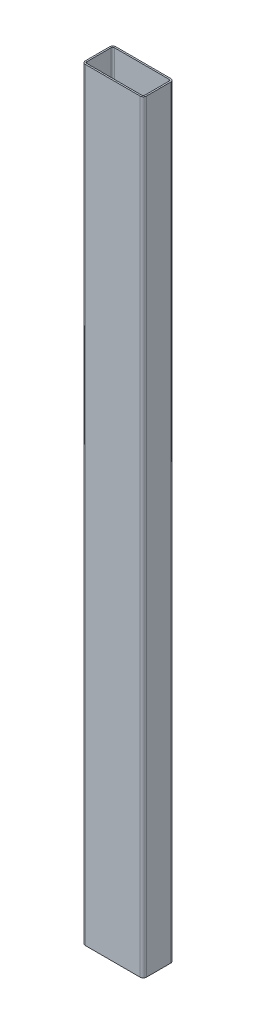
ISO-10303-21;
HEADER;
FILE_DESCRIPTION(('STEP AP214'),'2;1');
FILE_NAME('part.step','',(''),(''),'','','');
FILE_SCHEMA(('AUTOMOTIVE_DESIGN { 1 0 10303 214 1 1 1 1 }'));
ENDSEC;
DATA;
#1=APPLICATION_CONTEXT('core data for automotive mechanical design processes');
#2=APPLICATION_PROTOCOL_DEFINITION('international standard','automotive_design',2000,#1);
#3=PRODUCT_CONTEXT('',#1,'mechanical');
#4=PRODUCT('Part','Part','',(#3));
#5=PRODUCT_RELATED_PRODUCT_CATEGORY('part','',(#4));
#6=PRODUCT_DEFINITION_FORMATION('','',#4);
#7=PRODUCT_DEFINITION_CONTEXT('part definition',#1,'design');
#8=PRODUCT_DEFINITION('design','',#6,#7);
#9=PRODUCT_DEFINITION_SHAPE('','',#8);
#10=(LENGTH_UNIT() NAMED_UNIT(*) SI_UNIT(.MILLI.,.METRE.));
#11=(NAMED_UNIT(*) PLANE_ANGLE_UNIT() SI_UNIT($,.RADIAN.));
#12=(NAMED_UNIT(*) SI_UNIT($,.STERADIAN.) SOLID_ANGLE_UNIT());
#13=UNCERTAINTY_MEASURE_WITH_UNIT(LENGTH_MEASURE(1.E-05),#10,'distance_accuracy_value','');
#14=(GEOMETRIC_REPRESENTATION_CONTEXT(3) GLOBAL_UNCERTAINTY_ASSIGNED_CONTEXT((#13)) GLOBAL_UNIT_ASSIGNED_CONTEXT((#10,
#11,#12)) REPRESENTATION_CONTEXT('',''));
#15=CARTESIAN_POINT('',(0.,0.,0.));
#16=DIRECTION('',(0.,0.,1.));
#17=DIRECTION('',(1.,0.,0.));
#18=AXIS2_PLACEMENT_3D('',#15,#16,#17);
#19=CARTESIAN_POINT('',(-36.,500.,16.));
#20=DIRECTION('',(0.,1.,0.));
#21=DIRECTION('',(0.,0.,1.));
#22=AXIS2_PLACEMENT_3D('',#19,#20,#21);
#23=PLANE('',#22);
#24=CARTESIAN_POINT('',(-36.,500.,16.));
#25=DIRECTION('',(0.,1.,0.));
#26=DIRECTION('',(0.,0.,1.));
#27=AXIS2_PLACEMENT_3D('',#24,#25,#26);
#28=CIRCLE('',#27,4.);
#29=CARTESIAN_POINT('',(-40.,500.,16.));
#30=VERTEX_POINT('',#29);
#31=CARTESIAN_POINT('',(-36.,500.,20.));
#32=VERTEX_POINT('',#31);
#33=EDGE_CURVE('E211',#30,#32,#28,.T.);
#34=ORIENTED_EDGE('',*,*,#33,.T.);
#35=DIRECTION('',(1.,0.,0.));
#36=VECTOR('',#35,1.);
#37=CARTESIAN_POINT('',(-36.,500.,20.));
#38=LINE('',#37,#36);
#39=CARTESIAN_POINT('',(36.,500.,20.));
#40=VERTEX_POINT('',#39);
#41=EDGE_CURVE('E214',#32,#40,#38,.T.);
#42=ORIENTED_EDGE('',*,*,#41,.T.);
#43=CARTESIAN_POINT('',(36.,500.,16.));
#44=DIRECTION('',(0.,1.,0.));
#45=DIRECTION('',(0.,0.,1.));
#46=AXIS2_PLACEMENT_3D('',#43,#44,#45);
#47=CIRCLE('',#46,4.);
#48=CARTESIAN_POINT('',(40.,500.,16.));
#49=VERTEX_POINT('',#48);
#50=EDGE_CURVE('E217',#40,#49,#47,.T.);
#51=ORIENTED_EDGE('',*,*,#50,.T.);
#52=DIRECTION('',(0.,0.,-1.));
#53=VECTOR('',#52,1.);
#54=CARTESIAN_POINT('',(40.,500.,16.));
#55=LINE('',#54,#53);
#56=CARTESIAN_POINT('',(40.,500.,-16.));
#57=VERTEX_POINT('',#56);
#58=EDGE_CURVE('E219',#49,#57,#55,.T.);
#59=ORIENTED_EDGE('',*,*,#58,.T.);
#60=CARTESIAN_POINT('',(36.,500.,-16.));
#61=DIRECTION('',(0.,1.,0.));
#62=DIRECTION('',(0.,0.,-1.));
#63=AXIS2_PLACEMENT_3D('',#60,#61,#62);
#64=CIRCLE('',#63,4.00000000000001);
#65=CARTESIAN_POINT('',(36.,500.,-20.));
#66=VERTEX_POINT('',#65);
#67=EDGE_CURVE('E221',#57,#66,#64,.T.);
#68=ORIENTED_EDGE('',*,*,#67,.T.);
#69=DIRECTION('',(-1.,0.,0.));
#70=VECTOR('',#69,1.);
#71=CARTESIAN_POINT('',(-36.,500.,-20.));
#72=LINE('',#71,#70);
#73=CARTESIAN_POINT('',(-36.,500.,-20.));
#74=VERTEX_POINT('',#73);
#75=EDGE_CURVE('E223',#66,#74,#72,.T.);
#76=ORIENTED_EDGE('',*,*,#75,.T.);
#77=CARTESIAN_POINT('',(-36.,500.,-16.));
#78=DIRECTION('',(0.,1.,0.));
#79=DIRECTION('',(0.,0.,-1.));
#80=AXIS2_PLACEMENT_3D('',#77,#78,#79);
#81=CIRCLE('',#80,4.);
#82=CARTESIAN_POINT('',(-40.,500.,-16.));
#83=VERTEX_POINT('',#82);
#84=EDGE_CURVE('E225',#74,#83,#81,.T.);
#85=ORIENTED_EDGE('',*,*,#84,.T.);
#86=DIRECTION('',(0.,0.,1.));
#87=VECTOR('',#86,1.);
#88=CARTESIAN_POINT('',(-40.,500.,16.));
#89=LINE('',#88,#87);
#90=EDGE_CURVE('E227',#83,#30,#89,.T.);
#91=ORIENTED_EDGE('',*,*,#90,.T.);
#92=EDGE_LOOP('',(#34,#42,#51,#59,#68,#76,#85,#91));
#93=FACE_BOUND('',#92,.T.);
#94=DIRECTION('',(1.,0.,0.));
#95=VECTOR('',#94,1.);
#96=CARTESIAN_POINT('',(-36.,500.,18.));
#97=LINE('',#96,#95);
#98=CARTESIAN_POINT('',(-36.,500.,18.));
#99=VERTEX_POINT('',#98);
#100=CARTESIAN_POINT('',(36.,500.,18.));
#101=VERTEX_POINT('',#100);
#102=EDGE_CURVE('E154',#99,#101,#97,.T.);
#103=ORIENTED_EDGE('',*,*,#102,.F.);
#104=CARTESIAN_POINT('',(-36.,500.,16.));
#105=DIRECTION('',(0.,1.,0.));
#106=DIRECTION('',(0.,0.,1.));
#107=AXIS2_PLACEMENT_3D('',#104,#105,#106);
#108=CIRCLE('',#107,2.);
#109=CARTESIAN_POINT('',(-38.,500.,16.));
#110=VERTEX_POINT('',#109);
#111=EDGE_CURVE('E146',#110,#99,#108,.T.);
#112=ORIENTED_EDGE('',*,*,#111,.F.);
#113=DIRECTION('',(0.,0.,1.));
#114=VECTOR('',#113,1.);
#115=CARTESIAN_POINT('',(-38.,500.,16.));
#116=LINE('',#115,#114);
#117=CARTESIAN_POINT('',(-38.,500.,-16.));
#118=VERTEX_POINT('',#117);
#119=EDGE_CURVE('E179',#118,#110,#116,.T.);
#120=ORIENTED_EDGE('',*,*,#119,.F.);
#121=CARTESIAN_POINT('',(-36.,500.,-16.));
#122=DIRECTION('',(0.,1.,0.));
#123=DIRECTION('',(0.,0.,-1.));
#124=AXIS2_PLACEMENT_3D('',#121,#122,#123);
#125=CIRCLE('',#124,2.);
#126=CARTESIAN_POINT('',(-36.,500.,-18.));
#127=VERTEX_POINT('',#126);
#128=EDGE_CURVE('E177',#127,#118,#125,.T.);
#129=ORIENTED_EDGE('',*,*,#128,.F.);
#130=DIRECTION('',(-1.,0.,0.));
#131=VECTOR('',#130,1.);
#132=CARTESIAN_POINT('',(-36.,500.,-18.));
#133=LINE('',#132,#131);
#134=CARTESIAN_POINT('',(36.,500.,-18.));
#135=VERTEX_POINT('',#134);
#136=EDGE_CURVE('E175',#135,#127,#133,.T.);
#137=ORIENTED_EDGE('',*,*,#136,.F.);
#138=CARTESIAN_POINT('',(36.,500.,-16.));
#139=DIRECTION('',(0.,1.,0.));
#140=DIRECTION('',(0.,0.,-1.));
#141=AXIS2_PLACEMENT_3D('',#138,#139,#140);
#142=CIRCLE('',#141,2.);
#143=CARTESIAN_POINT('',(38.,500.,-16.));
#144=VERTEX_POINT('',#143);
#145=EDGE_CURVE('E173',#144,#135,#142,.T.);
#146=ORIENTED_EDGE('',*,*,#145,.F.);
#147=DIRECTION('',(0.,0.,-1.));
#148=VECTOR('',#147,1.);
#149=CARTESIAN_POINT('',(38.,500.,16.));
#150=LINE('',#149,#148);
#151=CARTESIAN_POINT('',(38.,500.,16.));
#152=VERTEX_POINT('',#151);
#153=EDGE_CURVE('E169',#152,#144,#150,.T.);
#154=ORIENTED_EDGE('',*,*,#153,.F.);
#155=CARTESIAN_POINT('',(36.,500.,16.));
#156=DIRECTION('',(0.,1.,0.));
#157=DIRECTION('',(0.,0.,1.));
#158=AXIS2_PLACEMENT_3D('',#155,#156,#157);
#159=CIRCLE('',#158,2.);
#160=EDGE_CURVE('E167',#101,#152,#159,.T.);
#161=ORIENTED_EDGE('',*,*,#160,.F.);
#162=EDGE_LOOP('',(#103,#112,#120,#129,#137,#146,#154,#161));
#163=FACE_BOUND('',#162,.T.);
#164=ADVANCED_FACE('F33',(#93,#163),#23,.T.);
#165=CARTESIAN_POINT('',(-36.,-500.,16.));
#166=DIRECTION('',(0.,1.,0.));
#167=DIRECTION('',(0.,0.,1.));
#168=AXIS2_PLACEMENT_3D('',#165,#166,#167);
#169=PLANE('',#168);
#170=CARTESIAN_POINT('',(-36.,-500.,16.));
#171=DIRECTION('',(0.,1.,0.));
#172=DIRECTION('',(0.,0.,1.));
#173=AXIS2_PLACEMENT_3D('',#170,#171,#172);
#174=CIRCLE('',#173,4.);
#175=CARTESIAN_POINT('',(-40.,-500.,16.));
#176=VERTEX_POINT('',#175);
#177=CARTESIAN_POINT('',(-36.,-500.,20.));
#178=VERTEX_POINT('',#177);
#179=EDGE_CURVE('E162',#176,#178,#174,.T.);
#180=ORIENTED_EDGE('',*,*,#179,.F.);
#181=DIRECTION('',(0.,0.,1.));
#182=VECTOR('',#181,1.);
#183=CARTESIAN_POINT('',(-40.,-500.,16.));
#184=LINE('',#183,#182);
#185=CARTESIAN_POINT('',(-40.,-500.,-16.));
#186=VERTEX_POINT('',#185);
#187=EDGE_CURVE('E215',#186,#176,#184,.T.);
#188=ORIENTED_EDGE('',*,*,#187,.F.);
#189=CARTESIAN_POINT('',(-36.,-500.,-16.));
#190=DIRECTION('',(0.,1.,0.));
#191=DIRECTION('',(0.,0.,-1.));
#192=AXIS2_PLACEMENT_3D('',#189,#190,#191);
#193=CIRCLE('',#192,4.);
#194=CARTESIAN_POINT('',(-36.,-500.,-20.));
#195=VERTEX_POINT('',#194);
#196=EDGE_CURVE('E242',#195,#186,#193,.T.);
#197=ORIENTED_EDGE('',*,*,#196,.F.);
#198=DIRECTION('',(-1.,0.,0.));
#199=VECTOR('',#198,1.);
#200=CARTESIAN_POINT('',(-36.,-500.,-20.));
#201=LINE('',#200,#199);
#202=CARTESIAN_POINT('',(36.,-500.,-20.));
#203=VERTEX_POINT('',#202);
#204=EDGE_CURVE('E240',#203,#195,#201,.T.);
#205=ORIENTED_EDGE('',*,*,#204,.F.);
#206=CARTESIAN_POINT('',(36.,-500.,-16.));
#207=DIRECTION('',(0.,1.,0.));
#208=DIRECTION('',(0.,0.,-1.));
#209=AXIS2_PLACEMENT_3D('',#206,#207,#208);
#210=CIRCLE('',#209,4.00000000000001);
#211=CARTESIAN_POINT('',(40.,-500.,-16.));
#212=VERTEX_POINT('',#211);
#213=EDGE_CURVE('E238',#212,#203,#210,.T.);
#214=ORIENTED_EDGE('',*,*,#213,.F.);
#215=DIRECTION('',(0.,0.,-1.));
#216=VECTOR('',#215,1.);
#217=CARTESIAN_POINT('',(40.,-500.,16.));
#218=LINE('',#217,#216);
#219=CARTESIAN_POINT('',(40.,-500.,16.));
#220=VERTEX_POINT('',#219);
#221=EDGE_CURVE('E236',#220,#212,#218,.T.);
#222=ORIENTED_EDGE('',*,*,#221,.F.);
#223=CARTESIAN_POINT('',(36.,-500.,16.));
#224=DIRECTION('',(0.,1.,0.));
#225=DIRECTION('',(0.,0.,1.));
#226=AXIS2_PLACEMENT_3D('',#223,#224,#225);
#227=CIRCLE('',#226,4.);
#228=CARTESIAN_POINT('',(36.,-500.,20.));
#229=VERTEX_POINT('',#228);
#230=EDGE_CURVE('E234',#229,#220,#227,.T.);
#231=ORIENTED_EDGE('',*,*,#230,.F.);
#232=DIRECTION('',(1.,0.,0.));
#233=VECTOR('',#232,1.);
#234=CARTESIAN_POINT('',(-36.,-500.,20.));
#235=LINE('',#234,#233);
#236=EDGE_CURVE('E232',#178,#229,#235,.T.);
#237=ORIENTED_EDGE('',*,*,#236,.F.);
#238=EDGE_LOOP('',(#180,#188,#197,#205,#214,#222,#231,#237));
#239=FACE_BOUND('',#238,.T.);
#240=CARTESIAN_POINT('',(-36.,-500.,16.));
#241=DIRECTION('',(0.,1.,0.));
#242=DIRECTION('',(0.,0.,1.));
#243=AXIS2_PLACEMENT_3D('',#240,#241,#242);
#244=CIRCLE('',#243,2.);
#245=CARTESIAN_POINT('',(-38.,-500.,16.));
#246=VERTEX_POINT('',#245);
#247=CARTESIAN_POINT('',(-36.,-500.,18.));
#248=VERTEX_POINT('',#247);
#249=EDGE_CURVE('E56',#246,#248,#244,.T.);
#250=ORIENTED_EDGE('',*,*,#249,.T.);
#251=DIRECTION('',(1.,0.,0.));
#252=VECTOR('',#251,1.);
#253=CARTESIAN_POINT('',(-36.,-500.,18.));
#254=LINE('',#253,#252);
#255=CARTESIAN_POINT('',(36.,-500.,18.));
#256=VERTEX_POINT('',#255);
#257=EDGE_CURVE('E161',#248,#256,#254,.T.);
#258=ORIENTED_EDGE('',*,*,#257,.T.);
#259=CARTESIAN_POINT('',(36.,-500.,16.));
#260=DIRECTION('',(0.,1.,0.));
#261=DIRECTION('',(0.,0.,1.));
#262=AXIS2_PLACEMENT_3D('',#259,#260,#261);
#263=CIRCLE('',#262,2.);
#264=CARTESIAN_POINT('',(38.,-500.,16.));
#265=VERTEX_POINT('',#264);
#266=EDGE_CURVE('E183',#256,#265,#263,.T.);
#267=ORIENTED_EDGE('',*,*,#266,.T.);
#268=DIRECTION('',(0.,0.,-1.));
#269=VECTOR('',#268,1.);
#270=CARTESIAN_POINT('',(38.,-500.,16.));
#271=LINE('',#270,#269);
#272=CARTESIAN_POINT('',(38.,-500.,-16.));
#273=VERTEX_POINT('',#272);
#274=EDGE_CURVE('E186',#265,#273,#271,.T.);
#275=ORIENTED_EDGE('',*,*,#274,.T.);
#276=CARTESIAN_POINT('',(36.,-500.,-16.));
#277=DIRECTION('',(0.,1.,0.));
#278=DIRECTION('',(0.,0.,-1.));
#279=AXIS2_PLACEMENT_3D('',#276,#277,#278);
#280=CIRCLE('',#279,2.);
#281=CARTESIAN_POINT('',(36.,-500.,-18.));
#282=VERTEX_POINT('',#281);
#283=EDGE_CURVE('E189',#273,#282,#280,.T.);
#284=ORIENTED_EDGE('',*,*,#283,.T.);
#285=DIRECTION('',(-1.,0.,0.));
#286=VECTOR('',#285,1.);
#287=CARTESIAN_POINT('',(-36.,-500.,-18.));
#288=LINE('',#287,#286);
#289=CARTESIAN_POINT('',(-36.,-500.,-18.));
#290=VERTEX_POINT('',#289);
#291=EDGE_CURVE('E192',#282,#290,#288,.T.);
#292=ORIENTED_EDGE('',*,*,#291,.T.);
#293=CARTESIAN_POINT('',(-36.,-500.,-16.));
#294=DIRECTION('',(0.,1.,0.));
#295=DIRECTION('',(0.,0.,-1.));
#296=AXIS2_PLACEMENT_3D('',#293,#294,#295);
#297=CIRCLE('',#296,2.);
#298=CARTESIAN_POINT('',(-38.,-500.,-16.));
#299=VERTEX_POINT('',#298);
#300=EDGE_CURVE('E195',#290,#299,#297,.T.);
#301=ORIENTED_EDGE('',*,*,#300,.T.);
#302=DIRECTION('',(0.,0.,1.));
#303=VECTOR('',#302,1.);
#304=CARTESIAN_POINT('',(-38.,-500.,16.));
#305=LINE('',#304,#303);
#306=EDGE_CURVE('E155',#299,#246,#305,.T.);
#307=ORIENTED_EDGE('',*,*,#306,.T.);
#308=EDGE_LOOP('',(#250,#258,#267,#275,#284,#292,#301,#307));
#309=FACE_BOUND('',#308,.T.);
#310=ADVANCED_FACE('F272',(#239,#309),#169,.F.);
#311=CARTESIAN_POINT('',(-36.,500.,16.));
#312=DIRECTION('',(0.,-1.,0.));
#313=DIRECTION('',(0.,0.,-1.));
#314=AXIS2_PLACEMENT_3D('',#311,#312,#313);
#315=CYLINDRICAL_SURFACE('',#314,4.);
#316=ORIENTED_EDGE('',*,*,#179,.T.);
#317=DIRECTION('',(0.,-1.,0.));
#318=VECTOR('',#317,1.);
#319=CARTESIAN_POINT('',(-36.,500.,20.));
#320=LINE('',#319,#318);
#321=EDGE_CURVE('E11',#32,#178,#320,.T.);
#322=ORIENTED_EDGE('',*,*,#321,.F.);
#323=ORIENTED_EDGE('',*,*,#33,.F.);
#324=DIRECTION('',(0.,-1.,0.));
#325=VECTOR('',#324,1.);
#326=CARTESIAN_POINT('',(-40.,500.,16.));
#327=LINE('',#326,#325);
#328=EDGE_CURVE('E229',#30,#176,#327,.T.);
#329=ORIENTED_EDGE('',*,*,#328,.T.);
#330=EDGE_LOOP('',(#316,#322,#323,#329));
#331=FACE_BOUND('',#330,.T.);
#332=ADVANCED_FACE('F35',(#331),#315,.T.);
#333=CARTESIAN_POINT('',(-36.,500.,20.));
#334=DIRECTION('',(0.,0.,-1.));
#335=DIRECTION('',(-1.,0.,0.));
#336=AXIS2_PLACEMENT_3D('',#333,#334,#335);
#337=PLANE('',#336);
#338=ORIENTED_EDGE('',*,*,#236,.T.);
#339=DIRECTION('',(0.,-1.,0.));
#340=VECTOR('',#339,1.);
#341=CARTESIAN_POINT('',(36.,500.,20.));
#342=LINE('',#341,#340);
#343=EDGE_CURVE('E41',#40,#229,#342,.T.);
#344=ORIENTED_EDGE('',*,*,#343,.F.);
#345=ORIENTED_EDGE('',*,*,#41,.F.);
#346=ORIENTED_EDGE('',*,*,#321,.T.);
#347=EDGE_LOOP('',(#338,#344,#345,#346));
#348=FACE_BOUND('',#347,.T.);
#349=ADVANCED_FACE('F289',(#348),#337,.F.);
#350=CARTESIAN_POINT('',(36.,500.,16.));
#351=DIRECTION('',(0.,-1.,0.));
#352=DIRECTION('',(0.,0.,-1.));
#353=AXIS2_PLACEMENT_3D('',#350,#351,#352);
#354=CYLINDRICAL_SURFACE('',#353,4.);
#355=ORIENTED_EDGE('',*,*,#230,.T.);
#356=DIRECTION('',(0.,-1.,0.));
#357=VECTOR('',#356,1.);
#358=CARTESIAN_POINT('',(40.,500.,16.));
#359=LINE('',#358,#357);
#360=EDGE_CURVE('E259',#49,#220,#359,.T.);
#361=ORIENTED_EDGE('',*,*,#360,.F.);
#362=ORIENTED_EDGE('',*,*,#50,.F.);
#363=ORIENTED_EDGE('',*,*,#343,.T.);
#364=EDGE_LOOP('',(#355,#361,#362,#363));
#365=FACE_BOUND('',#364,.T.);
#366=ADVANCED_FACE('F266',(#365),#354,.T.);
#367=CARTESIAN_POINT('',(40.,500.,16.));
#368=DIRECTION('',(-1.,0.,0.));
#369=DIRECTION('',(0.,0.,1.));
#370=AXIS2_PLACEMENT_3D('',#367,#368,#369);
#371=PLANE('',#370);
#372=ORIENTED_EDGE('',*,*,#221,.T.);
#373=DIRECTION('',(0.,-1.,0.));
#374=VECTOR('',#373,1.);
#375=CARTESIAN_POINT('',(40.,500.,-16.));
#376=LINE('',#375,#374);
#377=EDGE_CURVE('E256',#57,#212,#376,.T.);
#378=ORIENTED_EDGE('',*,*,#377,.F.);
#379=ORIENTED_EDGE('',*,*,#58,.F.);
#380=ORIENTED_EDGE('',*,*,#360,.T.);
#381=EDGE_LOOP('',(#372,#378,#379,#380));
#382=FACE_BOUND('',#381,.T.);
#383=ADVANCED_FACE('F278',(#382),#371,.F.);
#384=CARTESIAN_POINT('',(36.,500.,-16.));
#385=DIRECTION('',(0.,-1.,0.));
#386=DIRECTION('',(0.,0.,-1.));
#387=AXIS2_PLACEMENT_3D('',#384,#385,#386);
#388=CYLINDRICAL_SURFACE('',#387,4.00000000000001);
#389=ORIENTED_EDGE('',*,*,#213,.T.);
#390=DIRECTION('',(0.,-1.,0.));
#391=VECTOR('',#390,1.);
#392=CARTESIAN_POINT('',(36.,500.,-20.));
#393=LINE('',#392,#391);
#394=EDGE_CURVE('E253',#66,#203,#393,.T.);
#395=ORIENTED_EDGE('',*,*,#394,.F.);
#396=ORIENTED_EDGE('',*,*,#67,.F.);
#397=ORIENTED_EDGE('',*,*,#377,.T.);
#398=EDGE_LOOP('',(#389,#395,#396,#397));
#399=FACE_BOUND('',#398,.T.);
#400=ADVANCED_FACE('F282',(#399),#388,.T.);
#401=CARTESIAN_POINT('',(-36.,500.,-20.));
#402=DIRECTION('',(0.,0.,1.));
#403=DIRECTION('',(1.,0.,0.));
#404=AXIS2_PLACEMENT_3D('',#401,#402,#403);
#405=PLANE('',#404);
#406=ORIENTED_EDGE('',*,*,#204,.T.);
#407=DIRECTION('',(0.,-1.,0.));
#408=VECTOR('',#407,1.);
#409=CARTESIAN_POINT('',(-36.,500.,-20.));
#410=LINE('',#409,#408);
#411=EDGE_CURVE('E250',#74,#195,#410,.T.);
#412=ORIENTED_EDGE('',*,*,#411,.F.);
#413=ORIENTED_EDGE('',*,*,#75,.F.);
#414=ORIENTED_EDGE('',*,*,#394,.T.);
#415=EDGE_LOOP('',(#406,#412,#413,#414));
#416=FACE_BOUND('',#415,.T.);
#417=ADVANCED_FACE('F302',(#416),#405,.F.);
#418=CARTESIAN_POINT('',(-36.,500.,-16.));
#419=DIRECTION('',(0.,-1.,0.));
#420=DIRECTION('',(0.,0.,-1.));
#421=AXIS2_PLACEMENT_3D('',#418,#419,#420);
#422=CYLINDRICAL_SURFACE('',#421,4.);
#423=ORIENTED_EDGE('',*,*,#196,.T.);
#424=DIRECTION('',(0.,-1.,0.));
#425=VECTOR('',#424,1.);
#426=CARTESIAN_POINT('',(-40.,500.,-16.));
#427=LINE('',#426,#425);
#428=EDGE_CURVE('E247',#83,#186,#427,.T.);
#429=ORIENTED_EDGE('',*,*,#428,.F.);
#430=ORIENTED_EDGE('',*,*,#84,.F.);
#431=ORIENTED_EDGE('',*,*,#411,.T.);
#432=EDGE_LOOP('',(#423,#429,#430,#431));
#433=FACE_BOUND('',#432,.T.);
#434=ADVANCED_FACE('F300',(#433),#422,.T.);
#435=CARTESIAN_POINT('',(-40.,500.,16.));
#436=DIRECTION('',(1.,0.,0.));
#437=DIRECTION('',(0.,0.,-1.));
#438=AXIS2_PLACEMENT_3D('',#435,#436,#437);
#439=PLANE('',#438);
#440=ORIENTED_EDGE('',*,*,#187,.T.);
#441=ORIENTED_EDGE('',*,*,#328,.F.);
#442=ORIENTED_EDGE('',*,*,#90,.F.);
#443=ORIENTED_EDGE('',*,*,#428,.T.);
#444=EDGE_LOOP('',(#440,#441,#442,#443));
#445=FACE_BOUND('',#444,.T.);
#446=ADVANCED_FACE('F295',(#445),#439,.F.);
#447=CARTESIAN_POINT('',(-36.,500.,16.));
#448=DIRECTION('',(0.,-1.,0.));
#449=DIRECTION('',(0.,0.,-1.));
#450=AXIS2_PLACEMENT_3D('',#447,#448,#449);
#451=CYLINDRICAL_SURFACE('',#450,2.);
#452=ORIENTED_EDGE('',*,*,#249,.F.);
#453=DIRECTION('',(0.,-1.,0.));
#454=VECTOR('',#453,1.);
#455=CARTESIAN_POINT('',(-38.,500.,16.));
#456=LINE('',#455,#454);
#457=EDGE_CURVE('E150',#110,#246,#456,.T.);
#458=ORIENTED_EDGE('',*,*,#457,.F.);
#459=ORIENTED_EDGE('',*,*,#111,.T.);
#460=DIRECTION('',(0.,-1.,0.));
#461=VECTOR('',#460,1.);
#462=CARTESIAN_POINT('',(-36.,500.,18.));
#463=LINE('',#462,#461);
#464=EDGE_CURVE('E149',#99,#248,#463,.T.);
#465=ORIENTED_EDGE('',*,*,#464,.T.);
#466=EDGE_LOOP('',(#452,#458,#459,#465));
#467=FACE_BOUND('',#466,.T.);
#468=ADVANCED_FACE('F148',(#467),#451,.F.);
#469=CARTESIAN_POINT('',(-36.,500.,18.));
#470=DIRECTION('',(0.,0.,-1.));
#471=DIRECTION('',(-1.,0.,0.));
#472=AXIS2_PLACEMENT_3D('',#469,#470,#471);
#473=PLANE('',#472);
#474=ORIENTED_EDGE('',*,*,#257,.F.);
#475=ORIENTED_EDGE('',*,*,#464,.F.);
#476=ORIENTED_EDGE('',*,*,#102,.T.);
#477=DIRECTION('',(0.,-1.,0.));
#478=VECTOR('',#477,1.);
#479=CARTESIAN_POINT('',(36.,500.,18.));
#480=LINE('',#479,#478);
#481=EDGE_CURVE('E163',#101,#256,#480,.T.);
#482=ORIENTED_EDGE('',*,*,#481,.T.);
#483=EDGE_LOOP('',(#474,#475,#476,#482));
#484=FACE_BOUND('',#483,.T.);
#485=ADVANCED_FACE('F158',(#484),#473,.T.);
#486=CARTESIAN_POINT('',(36.,500.,16.));
#487=DIRECTION('',(0.,-1.,0.));
#488=DIRECTION('',(0.,0.,-1.));
#489=AXIS2_PLACEMENT_3D('',#486,#487,#488);
#490=CYLINDRICAL_SURFACE('',#489,2.);
#491=ORIENTED_EDGE('',*,*,#266,.F.);
#492=ORIENTED_EDGE('',*,*,#481,.F.);
#493=ORIENTED_EDGE('',*,*,#160,.T.);
#494=DIRECTION('',(0.,-1.,0.));
#495=VECTOR('',#494,1.);
#496=CARTESIAN_POINT('',(38.,500.,16.));
#497=LINE('',#496,#495);
#498=EDGE_CURVE('E208',#152,#265,#497,.T.);
#499=ORIENTED_EDGE('',*,*,#498,.T.);
#500=EDGE_LOOP('',(#491,#492,#493,#499));
#501=FACE_BOUND('',#500,.T.);
#502=ADVANCED_FACE('F327',(#501),#490,.F.);
#503=CARTESIAN_POINT('',(38.,500.,16.));
#504=DIRECTION('',(-1.,0.,0.));
#505=DIRECTION('',(0.,0.,1.));
#506=AXIS2_PLACEMENT_3D('',#503,#504,#505);
#507=PLANE('',#506);
#508=ORIENTED_EDGE('',*,*,#274,.F.);
#509=ORIENTED_EDGE('',*,*,#498,.F.);
#510=ORIENTED_EDGE('',*,*,#153,.T.);
#511=DIRECTION('',(0.,-1.,0.));
#512=VECTOR('',#511,1.);
#513=CARTESIAN_POINT('',(38.,500.,-16.));
#514=LINE('',#513,#512);
#515=EDGE_CURVE('E206',#144,#273,#514,.T.);
#516=ORIENTED_EDGE('',*,*,#515,.T.);
#517=EDGE_LOOP('',(#508,#509,#510,#516));
#518=FACE_BOUND('',#517,.T.);
#519=ADVANCED_FACE('F331',(#518),#507,.T.);
#520=CARTESIAN_POINT('',(36.,500.,-16.));
#521=DIRECTION('',(0.,-1.,0.));
#522=DIRECTION('',(0.,0.,-1.));
#523=AXIS2_PLACEMENT_3D('',#520,#521,#522);
#524=CYLINDRICAL_SURFACE('',#523,2.);
#525=ORIENTED_EDGE('',*,*,#283,.F.);
#526=ORIENTED_EDGE('',*,*,#515,.F.);
#527=ORIENTED_EDGE('',*,*,#145,.T.);
#528=DIRECTION('',(0.,-1.,0.));
#529=VECTOR('',#528,1.);
#530=CARTESIAN_POINT('',(36.,500.,-18.));
#531=LINE('',#530,#529);
#532=EDGE_CURVE('E204',#135,#282,#531,.T.);
#533=ORIENTED_EDGE('',*,*,#532,.T.);
#534=EDGE_LOOP('',(#525,#526,#527,#533));
#535=FACE_BOUND('',#534,.T.);
#536=ADVANCED_FACE('F337',(#535),#524,.F.);
#537=CARTESIAN_POINT('',(-36.,500.,-18.));
#538=DIRECTION('',(0.,0.,1.));
#539=DIRECTION('',(1.,0.,0.));
#540=AXIS2_PLACEMENT_3D('',#537,#538,#539);
#541=PLANE('',#540);
#542=ORIENTED_EDGE('',*,*,#291,.F.);
#543=ORIENTED_EDGE('',*,*,#532,.F.);
#544=ORIENTED_EDGE('',*,*,#136,.T.);
#545=DIRECTION('',(0.,-1.,0.));
#546=VECTOR('',#545,1.);
#547=CARTESIAN_POINT('',(-36.,500.,-18.));
#548=LINE('',#547,#546);
#549=EDGE_CURVE('E202',#127,#290,#548,.T.);
#550=ORIENTED_EDGE('',*,*,#549,.T.);
#551=EDGE_LOOP('',(#542,#543,#544,#550));
#552=FACE_BOUND('',#551,.T.);
#553=ADVANCED_FACE('F341',(#552),#541,.T.);
#554=CARTESIAN_POINT('',(-36.,500.,-16.));
#555=DIRECTION('',(0.,-1.,0.));
#556=DIRECTION('',(0.,0.,-1.));
#557=AXIS2_PLACEMENT_3D('',#554,#555,#556);
#558=CYLINDRICAL_SURFACE('',#557,2.);
#559=ORIENTED_EDGE('',*,*,#300,.F.);
#560=ORIENTED_EDGE('',*,*,#549,.F.);
#561=ORIENTED_EDGE('',*,*,#128,.T.);
#562=DIRECTION('',(0.,-1.,0.));
#563=VECTOR('',#562,1.);
#564=CARTESIAN_POINT('',(-38.,500.,-16.));
#565=LINE('',#564,#563);
#566=EDGE_CURVE('E48',#118,#299,#565,.T.);
#567=ORIENTED_EDGE('',*,*,#566,.T.);
#568=EDGE_LOOP('',(#559,#560,#561,#567));
#569=FACE_BOUND('',#568,.T.);
#570=ADVANCED_FACE('F345',(#569),#558,.F.);
#571=CARTESIAN_POINT('',(-38.,500.,16.));
#572=DIRECTION('',(1.,0.,0.));
#573=DIRECTION('',(0.,0.,-1.));
#574=AXIS2_PLACEMENT_3D('',#571,#572,#573);
#575=PLANE('',#574);
#576=ORIENTED_EDGE('',*,*,#306,.F.);
#577=ORIENTED_EDGE('',*,*,#566,.F.);
#578=ORIENTED_EDGE('',*,*,#119,.T.);
#579=ORIENTED_EDGE('',*,*,#457,.T.);
#580=EDGE_LOOP('',(#576,#577,#578,#579));
#581=FACE_BOUND('',#580,.T.);
#582=ADVANCED_FACE('F349',(#581),#575,.T.);
#583=CLOSED_SHELL('',(#164,#310,#332,#349,#366,#383,#400,#417,#434,#446,#468,#485,#502,#519,
#536,#553,#570,#582));
#584=MANIFOLD_SOLID_BREP('B2',#583);
#585=ADVANCED_BREP_SHAPE_REPRESENTATION('',(#18,#584),#14);
#586=SHAPE_DEFINITION_REPRESENTATION(#9,#585);
ENDSEC;
END-ISO-10303-21;
